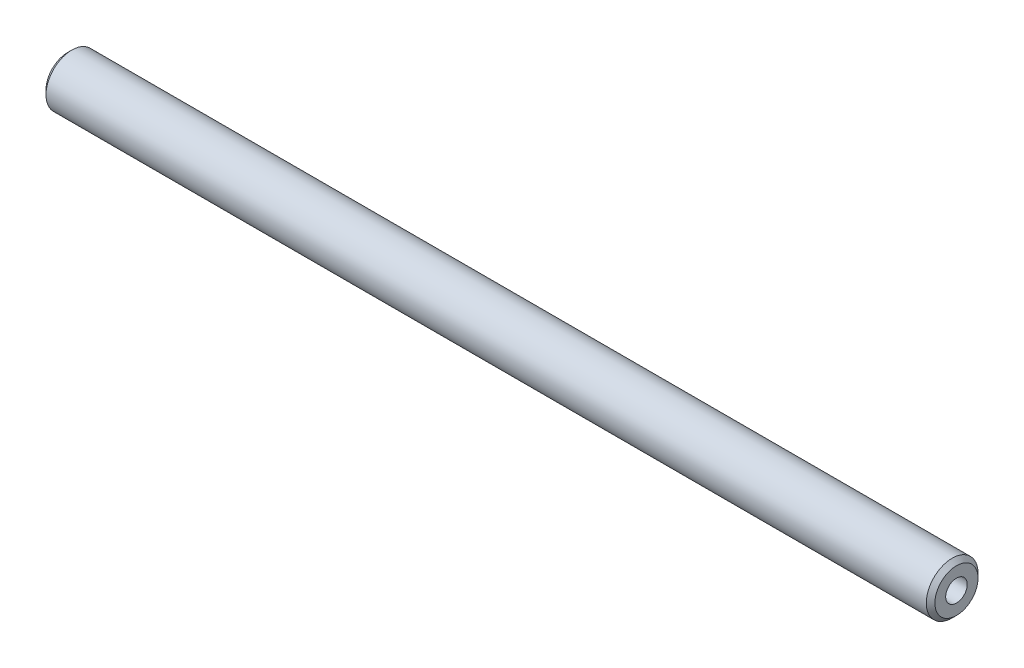
ISO-10303-21;
HEADER;
FILE_DESCRIPTION(('STEP AP214'),'2;1');
FILE_NAME('part.step','',(''),(''),'','','');
FILE_SCHEMA(('AUTOMOTIVE_DESIGN { 1 0 10303 214 1 1 1 1 }'));
ENDSEC;
DATA;
#1=APPLICATION_CONTEXT('core data for automotive mechanical design processes');
#2=APPLICATION_PROTOCOL_DEFINITION('international standard','automotive_design',2000,#1);
#3=PRODUCT_CONTEXT('',#1,'mechanical');
#4=PRODUCT('Part','Part','',(#3));
#5=PRODUCT_RELATED_PRODUCT_CATEGORY('part','',(#4));
#6=PRODUCT_DEFINITION_FORMATION('','',#4);
#7=PRODUCT_DEFINITION_CONTEXT('part definition',#1,'design');
#8=PRODUCT_DEFINITION('design','',#6,#7);
#9=PRODUCT_DEFINITION_SHAPE('','',#8);
#10=(LENGTH_UNIT() NAMED_UNIT(*) SI_UNIT(.MILLI.,.METRE.));
#11=(NAMED_UNIT(*) PLANE_ANGLE_UNIT() SI_UNIT($,.RADIAN.));
#12=(NAMED_UNIT(*) SI_UNIT($,.STERADIAN.) SOLID_ANGLE_UNIT());
#13=UNCERTAINTY_MEASURE_WITH_UNIT(LENGTH_MEASURE(1.E-05),#10,'distance_accuracy_value','');
#14=(GEOMETRIC_REPRESENTATION_CONTEXT(3) GLOBAL_UNCERTAINTY_ASSIGNED_CONTEXT((#13)) GLOBAL_UNIT_ASSIGNED_CONTEXT((#10,
#11,#12)) REPRESENTATION_CONTEXT('',''));
#15=CARTESIAN_POINT('',(0.,0.,0.));
#16=DIRECTION('',(0.,0.,1.));
#17=DIRECTION('',(1.,0.,0.));
#18=AXIS2_PLACEMENT_3D('',#15,#16,#17);
#19=CARTESIAN_POINT('',(0.,0.,0.));
#20=DIRECTION('',(1.,0.,0.));
#21=DIRECTION('',(0.,0.,-1.));
#22=AXIS2_PLACEMENT_3D('',#19,#20,#21);
#23=PLANE('',#22);
#24=CARTESIAN_POINT('',(0.,0.,0.));
#25=DIRECTION('',(1.,0.,0.));
#26=DIRECTION('',(0.,0.,-1.));
#27=AXIS2_PLACEMENT_3D('',#24,#25,#26);
#28=CIRCLE('',#27,2.5);
#29=CARTESIAN_POINT('',(0.,0.,-2.5));
#30=VERTEX_POINT('',#29);
#31=EDGE_CURVE('E95',#30,#30,#28,.F.);
#32=ORIENTED_EDGE('',*,*,#31,.T.);
#33=EDGE_LOOP('',(#32));
#34=FACE_BOUND('',#33,.T.);
#35=CARTESIAN_POINT('',(0.,0.,0.));
#36=DIRECTION('',(-1.,0.,0.));
#37=DIRECTION('',(0.,0.,1.));
#38=AXIS2_PLACEMENT_3D('',#35,#36,#37);
#39=CIRCLE('',#38,1.25);
#40=CARTESIAN_POINT('',(0.,0.,1.25));
#41=VERTEX_POINT('',#40);
#42=EDGE_CURVE('E79',#41,#41,#39,.T.);
#43=ORIENTED_EDGE('',*,*,#42,.F.);
#44=EDGE_LOOP('',(#43));
#45=FACE_BOUND('',#44,.T.);
#46=ADVANCED_FACE('F52',(#34,#45),#23,.F.);
#47=CARTESIAN_POINT('',(0.,0.,0.));
#48=DIRECTION('',(-1.,0.,0.));
#49=DIRECTION('',(0.,0.,1.));
#50=AXIS2_PLACEMENT_3D('',#47,#48,#49);
#51=CYLINDRICAL_SURFACE('',#50,3.);
#52=CARTESIAN_POINT('',(0.499999999999995,0.,0.));
#53=DIRECTION('',(1.,0.,0.));
#54=DIRECTION('',(0.,0.,-1.));
#55=AXIS2_PLACEMENT_3D('',#52,#53,#54);
#56=CIRCLE('',#55,3.);
#57=CARTESIAN_POINT('',(0.499999999999995,0.,-3.));
#58=VERTEX_POINT('',#57);
#59=EDGE_CURVE('E61',#58,#58,#56,.T.);
#60=ORIENTED_EDGE('',*,*,#59,.T.);
#61=EDGE_LOOP('',(#60));
#62=FACE_BOUND('',#61,.T.);
#63=CARTESIAN_POINT('',(102.5,0.,0.));
#64=DIRECTION('',(-1.,0.,0.));
#65=DIRECTION('',(0.,0.,1.));
#66=AXIS2_PLACEMENT_3D('',#63,#64,#65);
#67=CIRCLE('',#66,3.);
#68=CARTESIAN_POINT('',(102.5,0.,3.));
#69=VERTEX_POINT('',#68);
#70=EDGE_CURVE('E99',#69,#69,#67,.T.);
#71=ORIENTED_EDGE('',*,*,#70,.T.);
#72=EDGE_LOOP('',(#71));
#73=FACE_BOUND('',#72,.T.);
#74=ADVANCED_FACE('F107',(#62,#73),#51,.T.);
#75=CARTESIAN_POINT('',(103.,0.,0.));
#76=DIRECTION('',(-1.,0.,0.));
#77=DIRECTION('',(0.,0.,1.));
#78=AXIS2_PLACEMENT_3D('',#75,#76,#77);
#79=PLANE('',#78);
#80=CARTESIAN_POINT('',(103.,0.,0.));
#81=DIRECTION('',(-1.,0.,0.));
#82=DIRECTION('',(0.,0.,1.));
#83=AXIS2_PLACEMENT_3D('',#80,#81,#82);
#84=CIRCLE('',#83,2.49999999999999);
#85=CARTESIAN_POINT('',(103.,0.,2.49999999999999));
#86=VERTEX_POINT('',#85);
#87=EDGE_CURVE('E11',#86,#86,#84,.F.);
#88=ORIENTED_EDGE('',*,*,#87,.T.);
#89=EDGE_LOOP('',(#88));
#90=FACE_BOUND('',#89,.T.);
#91=CARTESIAN_POINT('',(103.,0.,0.));
#92=DIRECTION('',(1.,0.,0.));
#93=DIRECTION('',(0.,0.,-1.));
#94=AXIS2_PLACEMENT_3D('',#91,#92,#93);
#95=CIRCLE('',#94,1.24999999999999);
#96=CARTESIAN_POINT('',(103.,0.,-1.24999999999999));
#97=VERTEX_POINT('',#96);
#98=EDGE_CURVE('E80',#97,#97,#95,.T.);
#99=ORIENTED_EDGE('',*,*,#98,.F.);
#100=EDGE_LOOP('',(#99));
#101=FACE_BOUND('',#100,.T.);
#102=ADVANCED_FACE('F127',(#90,#101),#79,.F.);
#103=CARTESIAN_POINT('',(8.5,0.,0.));
#104=DIRECTION('',(-1.,0.,0.));
#105=DIRECTION('',(0.,0.,1.));
#106=AXIS2_PLACEMENT_3D('',#103,#104,#105);
#107=CONICAL_SURFACE('',#106,1.25,1.02974425867666);
#108=CARTESIAN_POINT('',(9.25107577378445,0.,0.));
#109=VERTEX_POINT('',#108);
#110=VERTEX_LOOP('',#109);
#111=FACE_BOUND('',#110,.T.);
#112=CARTESIAN_POINT('',(8.5,0.,0.));
#113=DIRECTION('',(-1.,0.,0.));
#114=DIRECTION('',(0.,0.,1.));
#115=AXIS2_PLACEMENT_3D('',#112,#113,#114);
#116=CIRCLE('',#115,1.25);
#117=CARTESIAN_POINT('',(8.5,0.,1.25));
#118=VERTEX_POINT('',#117);
#119=EDGE_CURVE('E87',#118,#118,#116,.T.);
#120=ORIENTED_EDGE('',*,*,#119,.T.);
#121=EDGE_LOOP('',(#120));
#122=FACE_BOUND('',#121,.T.);
#123=ADVANCED_FACE('F121',(#111,#122),#107,.F.);
#124=CARTESIAN_POINT('',(0.,0.,0.));
#125=DIRECTION('',(-1.,0.,0.));
#126=DIRECTION('',(0.,0.,1.));
#127=AXIS2_PLACEMENT_3D('',#124,#125,#126);
#128=CYLINDRICAL_SURFACE('',#127,1.25);
#129=ORIENTED_EDGE('',*,*,#119,.F.);
#130=EDGE_LOOP('',(#129));
#131=FACE_BOUND('',#130,.T.);
#132=ORIENTED_EDGE('',*,*,#42,.T.);
#133=EDGE_LOOP('',(#132));
#134=FACE_BOUND('',#133,.T.);
#135=ADVANCED_FACE('F72',(#131,#134),#128,.F.);
#136=CARTESIAN_POINT('',(94.5,0.,0.));
#137=DIRECTION('',(1.,0.,0.));
#138=DIRECTION('',(0.,0.,-1.));
#139=AXIS2_PLACEMENT_3D('',#136,#137,#138);
#140=CONICAL_SURFACE('',#139,1.24999999999999,1.02974425867665);
#141=CARTESIAN_POINT('',(93.7489242262156,0.,0.));
#142=VERTEX_POINT('',#141);
#143=VERTEX_LOOP('',#142);
#144=FACE_BOUND('',#143,.T.);
#145=CARTESIAN_POINT('',(94.5,0.,0.));
#146=DIRECTION('',(1.,0.,0.));
#147=DIRECTION('',(0.,0.,-1.));
#148=AXIS2_PLACEMENT_3D('',#145,#146,#147);
#149=CIRCLE('',#148,1.24999999999999);
#150=CARTESIAN_POINT('',(94.5,0.,-1.24999999999999));
#151=VERTEX_POINT('',#150);
#152=EDGE_CURVE('E76',#151,#151,#149,.T.);
#153=ORIENTED_EDGE('',*,*,#152,.T.);
#154=EDGE_LOOP('',(#153));
#155=FACE_BOUND('',#154,.T.);
#156=ADVANCED_FACE('F68',(#144,#155),#140,.F.);
#157=CARTESIAN_POINT('',(103.,0.,0.));
#158=DIRECTION('',(1.,0.,0.));
#159=DIRECTION('',(0.,0.,-1.));
#160=AXIS2_PLACEMENT_3D('',#157,#158,#159);
#161=CYLINDRICAL_SURFACE('',#160,1.24999999999999);
#162=ORIENTED_EDGE('',*,*,#152,.F.);
#163=EDGE_LOOP('',(#162));
#164=FACE_BOUND('',#163,.T.);
#165=ORIENTED_EDGE('',*,*,#98,.T.);
#166=EDGE_LOOP('',(#165));
#167=FACE_BOUND('',#166,.T.);
#168=ADVANCED_FACE('F71',(#164,#167),#161,.F.);
#169=CARTESIAN_POINT('',(0.,0.,0.));
#170=DIRECTION('',(1.,0.,0.));
#171=DIRECTION('',(0.,0.,-1.));
#172=AXIS2_PLACEMENT_3D('',#169,#170,#171);
#173=CONICAL_SURFACE('',#172,2.5,0.785398163397452);
#174=ORIENTED_EDGE('',*,*,#59,.F.);
#175=EDGE_LOOP('',(#174));
#176=FACE_BOUND('',#175,.T.);
#177=ORIENTED_EDGE('',*,*,#31,.F.);
#178=EDGE_LOOP('',(#177));
#179=FACE_BOUND('',#178,.T.);
#180=ADVANCED_FACE('F110',(#176,#179),#173,.T.);
#181=CARTESIAN_POINT('',(102.5,0.,0.));
#182=DIRECTION('',(-1.,0.,0.));
#183=DIRECTION('',(0.,0.,1.));
#184=AXIS2_PLACEMENT_3D('',#181,#182,#183);
#185=CONICAL_SURFACE('',#184,3.,0.785398163397446);
#186=ORIENTED_EDGE('',*,*,#87,.F.);
#187=EDGE_LOOP('',(#186));
#188=FACE_BOUND('',#187,.T.);
#189=ORIENTED_EDGE('',*,*,#70,.F.);
#190=EDGE_LOOP('',(#189));
#191=FACE_BOUND('',#190,.T.);
#192=ADVANCED_FACE('F54',(#188,#191),#185,.T.);
#193=CLOSED_SHELL('',(#46,#74,#102,#123,#135,#156,#168,#180,#192));
#194=MANIFOLD_SOLID_BREP('B2',#193);
#195=ADVANCED_BREP_SHAPE_REPRESENTATION('',(#18,#194),#14);
#196=SHAPE_DEFINITION_REPRESENTATION(#9,#195);
ENDSEC;
END-ISO-10303-21;
